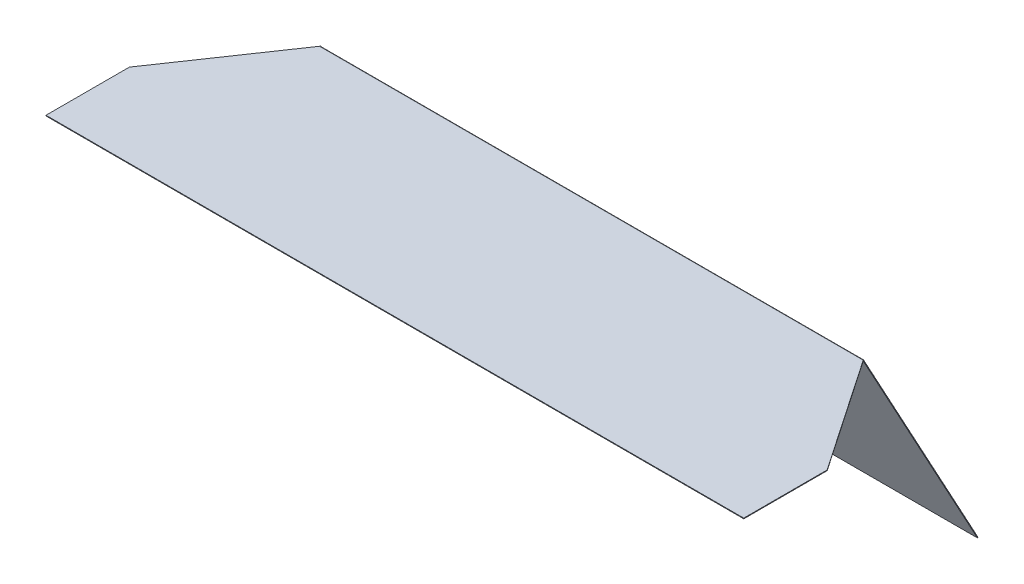
ISO-10303-21;
HEADER;
FILE_DESCRIPTION(('STEP AP214'),'2;1');
FILE_NAME('part.step','',(''),(''),'','','');
FILE_SCHEMA(('AUTOMOTIVE_DESIGN { 1 0 10303 214 1 1 1 1 }'));
ENDSEC;
DATA;
#1=APPLICATION_CONTEXT('core data for automotive mechanical design processes');
#2=APPLICATION_PROTOCOL_DEFINITION('international standard','automotive_design',2000,#1);
#3=PRODUCT_CONTEXT('',#1,'mechanical');
#4=PRODUCT('Part','Part','',(#3));
#5=PRODUCT_RELATED_PRODUCT_CATEGORY('part','',(#4));
#6=PRODUCT_DEFINITION_FORMATION('','',#4);
#7=PRODUCT_DEFINITION_CONTEXT('part definition',#1,'design');
#8=PRODUCT_DEFINITION('design','',#6,#7);
#9=PRODUCT_DEFINITION_SHAPE('','',#8);
#10=(LENGTH_UNIT() NAMED_UNIT(*) SI_UNIT(.MILLI.,.METRE.));
#11=(NAMED_UNIT(*) PLANE_ANGLE_UNIT() SI_UNIT($,.RADIAN.));
#12=(NAMED_UNIT(*) SI_UNIT($,.STERADIAN.) SOLID_ANGLE_UNIT());
#13=UNCERTAINTY_MEASURE_WITH_UNIT(LENGTH_MEASURE(1.E-05),#10,'distance_accuracy_value','');
#14=(GEOMETRIC_REPRESENTATION_CONTEXT(3) GLOBAL_UNCERTAINTY_ASSIGNED_CONTEXT((#13)) GLOBAL_UNIT_ASSIGNED_CONTEXT((#10,
#11,#12)) REPRESENTATION_CONTEXT('',''));
#15=CARTESIAN_POINT('',(0.,0.,0.));
#16=DIRECTION('',(0.,0.,1.));
#17=DIRECTION('',(1.,0.,0.));
#18=AXIS2_PLACEMENT_3D('',#15,#16,#17);
#19=CARTESIAN_POINT('',(335.,-0.800000000000009,-122.));
#20=DIRECTION('',(-1.,0.,0.));
#21=DIRECTION('',(0.,0.,1.));
#22=AXIS2_PLACEMENT_3D('',#19,#20,#21);
#23=PLANE('',#22);
#24=DIRECTION('',(0.,1.,0.));
#25=VECTOR('',#24,1.);
#26=CARTESIAN_POINT('',(335.,-0.8,-122.));
#27=LINE('',#26,#25);
#28=CARTESIAN_POINT('',(335.,-0.80108157338544,-122.));
#29=VERTEX_POINT('',#28);
#30=CARTESIAN_POINT('',(335.,0.,-122.));
#31=VERTEX_POINT('',#30);
#32=EDGE_CURVE('E305',#29,#31,#27,.T.);
#33=ORIENTED_EDGE('',*,*,#32,.F.);
#34=CARTESIAN_POINT('',(335.,-1.6,-120.613735469827));
#35=DIRECTION('',(1.,0.,0.));
#36=DIRECTION('',(0.,0.,-1.));
#37=AXIS2_PLACEMENT_3D('',#34,#35,#36);
#38=CIRCLE('',#37,1.60000000000001);
#39=CARTESIAN_POINT('',(335.,0.,-120.613735469827));
#40=VERTEX_POINT('',#39);
#41=EDGE_CURVE('E13',#29,#40,#38,.T.);
#42=ORIENTED_EDGE('',*,*,#41,.T.);
#43=DIRECTION('',(0.,0.,-1.));
#44=VECTOR('',#43,1.);
#45=CARTESIAN_POINT('',(335.,0.,-122.000000000031));
#46=LINE('',#45,#44);
#47=EDGE_CURVE('E63',#40,#31,#46,.T.);
#48=ORIENTED_EDGE('',*,*,#47,.T.);
#49=EDGE_LOOP('',(#33,#42,#48));
#50=FACE_BOUND('',#49,.T.);
#51=ADVANCED_FACE('F53',(#50),#23,.T.);
#52=CARTESIAN_POINT('',(-335.,-0.799999999999997,-120.613735469827));
#53=DIRECTION('',(1.,0.,0.));
#54=DIRECTION('',(0.,0.,-1.));
#55=AXIS2_PLACEMENT_3D('',#52,#53,#54);
#56=PLANE('',#55);
#57=DIRECTION('',(0.,0.,1.));
#58=VECTOR('',#57,1.);
#59=CARTESIAN_POINT('',(-335.,0.,-121.999999999996));
#60=LINE('',#59,#58);
#61=CARTESIAN_POINT('',(-335.,0.,-122.));
#62=VERTEX_POINT('',#61);
#63=CARTESIAN_POINT('',(-335.,0.,-120.613735469827));
#64=VERTEX_POINT('',#63);
#65=EDGE_CURVE('E301',#62,#64,#60,.T.);
#66=ORIENTED_EDGE('',*,*,#65,.T.);
#67=CARTESIAN_POINT('',(-335.,-1.6,-120.613735469827));
#68=DIRECTION('',(1.,0.,0.));
#69=DIRECTION('',(0.,0.,-1.));
#70=AXIS2_PLACEMENT_3D('',#67,#68,#69);
#71=CIRCLE('',#70,1.60000000000001);
#72=CARTESIAN_POINT('',(-335.,-0.80108157338544,-122.));
#73=VERTEX_POINT('',#72);
#74=EDGE_CURVE('E200',#64,#73,#71,.F.);
#75=ORIENTED_EDGE('',*,*,#74,.T.);
#76=DIRECTION('',(0.,1.,0.));
#77=VECTOR('',#76,1.);
#78=CARTESIAN_POINT('',(-335.,-0.8,-122.));
#79=LINE('',#78,#77);
#80=EDGE_CURVE('E302',#73,#62,#79,.T.);
#81=ORIENTED_EDGE('',*,*,#80,.T.);
#82=EDGE_LOOP('',(#66,#75,#81));
#83=FACE_BOUND('',#82,.T.);
#84=ADVANCED_FACE('F229',(#83),#56,.T.);
#85=CARTESIAN_POINT('',(-431.,-0.8,-122.));
#86=DIRECTION('',(0.,-1.,0.));
#87=DIRECTION('',(0.,0.,-1.));
#88=AXIS2_PLACEMENT_3D('',#85,#86,#87);
#89=PLANE('',#88);
#90=DIRECTION('',(1.,0.,0.));
#91=VECTOR('',#90,1.);
#92=CARTESIAN_POINT('',(335.,-0.799999999999997,-120.613735469827));
#93=LINE('',#92,#91);
#94=CARTESIAN_POINT('',(335.,-0.8,-120.613735469827));
#95=VERTEX_POINT('',#94);
#96=CARTESIAN_POINT('',(-335.,-0.8,-120.613735469827));
#97=VERTEX_POINT('',#96);
#98=EDGE_CURVE('E70',#95,#97,#93,.F.);
#99=ORIENTED_EDGE('',*,*,#98,.F.);
#100=DIRECTION('',(0.,0.,1.));
#101=VECTOR('',#100,1.);
#102=CARTESIAN_POINT('',(335.,-0.800000000000009,-122.));
#103=LINE('',#102,#101);
#104=EDGE_CURVE('E285',#29,#95,#103,.T.);
#105=ORIENTED_EDGE('',*,*,#104,.F.);
#106=DIRECTION('',(-0.562790977082026,0.,-0.826599247589217));
#107=VECTOR('',#106,1.);
#108=CARTESIAN_POINT('',(431.000000000001,-0.8,18.9999999999996));
#109=LINE('',#108,#107);
#110=CARTESIAN_POINT('',(431.000000000001,-0.8,18.9999999999996));
#111=VERTEX_POINT('',#110);
#112=EDGE_CURVE('E319',#111,#29,#109,.T.);
#113=ORIENTED_EDGE('',*,*,#112,.F.);
#114=DIRECTION('',(0.,0.,-1.));
#115=VECTOR('',#114,1.);
#116=CARTESIAN_POINT('',(431.,-0.8,122.));
#117=LINE('',#116,#115);
#118=CARTESIAN_POINT('',(431.,-0.8,122.));
#119=VERTEX_POINT('',#118);
#120=EDGE_CURVE('E290',#119,#111,#117,.T.);
#121=ORIENTED_EDGE('',*,*,#120,.F.);
#122=DIRECTION('',(1.,0.,0.));
#123=VECTOR('',#122,1.);
#124=CARTESIAN_POINT('',(-431.,-0.8,122.));
#125=LINE('',#124,#123);
#126=CARTESIAN_POINT('',(-431.,-0.8,122.));
#127=VERTEX_POINT('',#126);
#128=EDGE_CURVE('E337',#127,#119,#125,.T.);
#129=ORIENTED_EDGE('',*,*,#128,.F.);
#130=DIRECTION('',(0.,0.,1.));
#131=VECTOR('',#130,1.);
#132=CARTESIAN_POINT('',(-431.,-0.8,122.));
#133=LINE('',#132,#131);
#134=CARTESIAN_POINT('',(-431.,-0.8,19.));
#135=VERTEX_POINT('',#134);
#136=EDGE_CURVE('E298',#135,#127,#133,.T.);
#137=ORIENTED_EDGE('',*,*,#136,.F.);
#138=DIRECTION('',(-0.562790977082021,0.,0.82659924758922));
#139=VECTOR('',#138,1.);
#140=CARTESIAN_POINT('',(-335.,-0.8,-122.));
#141=LINE('',#140,#139);
#142=EDGE_CURVE('E308',#73,#135,#141,.T.);
#143=ORIENTED_EDGE('',*,*,#142,.F.);
#144=DIRECTION('',(0.,0.,-1.));
#145=VECTOR('',#144,1.);
#146=CARTESIAN_POINT('',(-335.,-0.799999999999997,-120.613735469827));
#147=LINE('',#146,#145);
#148=EDGE_CURVE('E287',#97,#73,#147,.T.);
#149=ORIENTED_EDGE('',*,*,#148,.F.);
#150=EDGE_LOOP('',(#99,#105,#113,#121,#129,#137,#143,#149));
#151=FACE_BOUND('',#150,.T.);
#152=ADVANCED_FACE('F235',(#151),#89,.T.);
#153=CARTESIAN_POINT('',(-431.,0.,-122.));
#154=DIRECTION('',(0.,-1.,0.));
#155=DIRECTION('',(0.,0.,-1.));
#156=AXIS2_PLACEMENT_3D('',#153,#154,#155);
#157=PLANE('',#156);
#158=ORIENTED_EDGE('',*,*,#47,.F.);
#159=DIRECTION('',(1.,0.,0.));
#160=VECTOR('',#159,1.);
#161=CARTESIAN_POINT('',(335.,0.,-120.613735469827));
#162=LINE('',#161,#160);
#163=EDGE_CURVE('E148',#40,#64,#162,.F.);
#164=ORIENTED_EDGE('',*,*,#163,.T.);
#165=ORIENTED_EDGE('',*,*,#65,.F.);
#166=DIRECTION('',(-0.562790977082021,0.,0.82659924758922));
#167=VECTOR('',#166,1.);
#168=CARTESIAN_POINT('',(-335.,0.,-122.));
#169=LINE('',#168,#167);
#170=CARTESIAN_POINT('',(-431.,0.,19.));
#171=VERTEX_POINT('',#170);
#172=EDGE_CURVE('E283',#62,#171,#169,.T.);
#173=ORIENTED_EDGE('',*,*,#172,.T.);
#174=DIRECTION('',(0.,0.,1.));
#175=VECTOR('',#174,1.);
#176=CARTESIAN_POINT('',(-431.,0.,122.));
#177=LINE('',#176,#175);
#178=CARTESIAN_POINT('',(-431.,0.,122.));
#179=VERTEX_POINT('',#178);
#180=EDGE_CURVE('E277',#171,#179,#177,.T.);
#181=ORIENTED_EDGE('',*,*,#180,.T.);
#182=DIRECTION('',(1.,0.,0.));
#183=VECTOR('',#182,1.);
#184=CARTESIAN_POINT('',(-431.,0.,122.));
#185=LINE('',#184,#183);
#186=CARTESIAN_POINT('',(431.,0.,122.));
#187=VERTEX_POINT('',#186);
#188=EDGE_CURVE('E268',#179,#187,#185,.T.);
#189=ORIENTED_EDGE('',*,*,#188,.T.);
#190=DIRECTION('',(0.,0.,-1.));
#191=VECTOR('',#190,1.);
#192=CARTESIAN_POINT('',(431.,0.,122.));
#193=LINE('',#192,#191);
#194=CARTESIAN_POINT('',(431.000000000001,0.,18.9999999999996));
#195=VERTEX_POINT('',#194);
#196=EDGE_CURVE('E276',#187,#195,#193,.T.);
#197=ORIENTED_EDGE('',*,*,#196,.T.);
#198=DIRECTION('',(-0.562790977082026,0.,-0.826599247589217));
#199=VECTOR('',#198,1.);
#200=CARTESIAN_POINT('',(431.000000000001,0.,18.9999999999996));
#201=LINE('',#200,#199);
#202=EDGE_CURVE('E294',#195,#31,#201,.T.);
#203=ORIENTED_EDGE('',*,*,#202,.T.);
#204=EDGE_LOOP('',(#158,#164,#165,#173,#181,#189,#197,#203));
#205=FACE_BOUND('',#204,.T.);
#206=ADVANCED_FACE('F243',(#205),#157,.F.);
#207=CARTESIAN_POINT('',(-431.,-0.8,122.));
#208=DIRECTION('',(-1.,0.,0.));
#209=DIRECTION('',(0.,0.,1.));
#210=AXIS2_PLACEMENT_3D('',#207,#208,#209);
#211=PLANE('',#210);
#212=ORIENTED_EDGE('',*,*,#180,.F.);
#213=DIRECTION('',(0.,1.,0.));
#214=VECTOR('',#213,1.);
#215=CARTESIAN_POINT('',(-431.,-0.8,19.));
#216=LINE('',#215,#214);
#217=EDGE_CURVE('E299',#135,#171,#216,.T.);
#218=ORIENTED_EDGE('',*,*,#217,.F.);
#219=ORIENTED_EDGE('',*,*,#136,.T.);
#220=DIRECTION('',(0.,1.,0.));
#221=VECTOR('',#220,1.);
#222=CARTESIAN_POINT('',(-431.,-0.8,122.));
#223=LINE('',#222,#221);
#224=EDGE_CURVE('E271',#127,#179,#223,.T.);
#225=ORIENTED_EDGE('',*,*,#224,.T.);
#226=EDGE_LOOP('',(#212,#218,#219,#225));
#227=FACE_BOUND('',#226,.T.);
#228=ADVANCED_FACE('F55',(#227),#211,.T.);
#229=CARTESIAN_POINT('',(-335.,-0.8,-122.));
#230=DIRECTION('',(-0.82659924758922,0.,-0.562790977082021));
#231=DIRECTION('',(-0.562790977082021,0.,0.82659924758922));
#232=AXIS2_PLACEMENT_3D('',#229,#230,#231);
#233=PLANE('',#232);
#234=ORIENTED_EDGE('',*,*,#172,.F.);
#235=ORIENTED_EDGE('',*,*,#80,.F.);
#236=ORIENTED_EDGE('',*,*,#142,.T.);
#237=ORIENTED_EDGE('',*,*,#217,.T.);
#238=EDGE_LOOP('',(#234,#235,#236,#237));
#239=FACE_BOUND('',#238,.T.);
#240=ADVANCED_FACE('F247',(#239),#233,.T.);
#241=CARTESIAN_POINT('',(431.000000000001,-0.8,18.9999999999996));
#242=DIRECTION('',(0.826599247589217,0.,-0.562790977082026));
#243=DIRECTION('',(-0.562790977082026,0.,-0.826599247589217));
#244=AXIS2_PLACEMENT_3D('',#241,#242,#243);
#245=PLANE('',#244);
#246=ORIENTED_EDGE('',*,*,#202,.F.);
#247=DIRECTION('',(0.,1.,0.));
#248=VECTOR('',#247,1.);
#249=CARTESIAN_POINT('',(431.000000000001,-0.8,18.9999999999996));
#250=LINE('',#249,#248);
#251=EDGE_CURVE('E303',#111,#195,#250,.T.);
#252=ORIENTED_EDGE('',*,*,#251,.F.);
#253=ORIENTED_EDGE('',*,*,#112,.T.);
#254=ORIENTED_EDGE('',*,*,#32,.T.);
#255=EDGE_LOOP('',(#246,#252,#253,#254));
#256=FACE_BOUND('',#255,.T.);
#257=ADVANCED_FACE('F250',(#256),#245,.T.);
#258=CARTESIAN_POINT('',(431.,-0.8,122.));
#259=DIRECTION('',(1.,0.,0.));
#260=DIRECTION('',(0.,0.,-1.));
#261=AXIS2_PLACEMENT_3D('',#258,#259,#260);
#262=PLANE('',#261);
#263=ORIENTED_EDGE('',*,*,#196,.F.);
#264=DIRECTION('',(0.,1.,0.));
#265=VECTOR('',#264,1.);
#266=CARTESIAN_POINT('',(431.,-0.8,122.));
#267=LINE('',#266,#265);
#268=EDGE_CURVE('E273',#119,#187,#267,.T.);
#269=ORIENTED_EDGE('',*,*,#268,.F.);
#270=ORIENTED_EDGE('',*,*,#120,.T.);
#271=ORIENTED_EDGE('',*,*,#251,.T.);
#272=EDGE_LOOP('',(#263,#269,#270,#271));
#273=FACE_BOUND('',#272,.T.);
#274=ADVANCED_FACE('F254',(#273),#262,.T.);
#275=CARTESIAN_POINT('',(-431.,-0.8,122.));
#276=DIRECTION('',(0.,0.,1.));
#277=DIRECTION('',(1.,0.,0.));
#278=AXIS2_PLACEMENT_3D('',#275,#276,#277);
#279=PLANE('',#278);
#280=ORIENTED_EDGE('',*,*,#188,.F.);
#281=ORIENTED_EDGE('',*,*,#224,.F.);
#282=ORIENTED_EDGE('',*,*,#128,.T.);
#283=ORIENTED_EDGE('',*,*,#268,.T.);
#284=EDGE_LOOP('',(#280,#281,#282,#283));
#285=FACE_BOUND('',#284,.T.);
#286=ADVANCED_FACE('F257',(#285),#279,.T.);
#287=CARTESIAN_POINT('',(-335.,-1.6,-120.613735469827));
#288=DIRECTION('',(-1.,0.,0.));
#289=DIRECTION('',(0.,0.,1.));
#290=AXIS2_PLACEMENT_3D('',#287,#288,#289);
#291=PLANE('',#290);
#292=CARTESIAN_POINT('',(-335.,-1.6,-120.613735469827));
#293=DIRECTION('',(1.,0.,0.));
#294=DIRECTION('',(0.,0.,-1.));
#295=AXIS2_PLACEMENT_3D('',#292,#293,#294);
#296=CIRCLE('',#295,0.800000000000007);
#297=CARTESIAN_POINT('',(-335.,-1.21827299179231,-121.316789159957));
#298=VERTEX_POINT('',#297);
#299=EDGE_CURVE('E149',#97,#298,#296,.F.);
#300=ORIENTED_EDGE('',*,*,#299,.F.);
#301=ORIENTED_EDGE('',*,*,#148,.T.);
#302=CARTESIAN_POINT('',(-335.,-0.836545983584618,-122.019842850086));
#303=VERTEX_POINT('',#302);
#304=EDGE_CURVE('E194',#73,#303,#71,.F.);
#305=ORIENTED_EDGE('',*,*,#304,.T.);
#306=DIRECTION('',(0.,0.477158760259613,-0.878817112661963));
#307=VECTOR('',#306,1.);
#308=CARTESIAN_POINT('',(-335.,-0.836545983584625,-122.019842850086));
#309=LINE('',#308,#307);
#310=EDGE_CURVE('E191',#298,#303,#309,.T.);
#311=ORIENTED_EDGE('',*,*,#310,.F.);
#312=EDGE_LOOP('',(#300,#301,#305,#311));
#313=FACE_BOUND('',#312,.T.);
#314=ADVANCED_FACE('F260',(#313),#291,.T.);
#315=CARTESIAN_POINT('',(335.,-1.6,-120.613735469827));
#316=DIRECTION('',(-1.,0.,0.));
#317=DIRECTION('',(0.,0.,1.));
#318=AXIS2_PLACEMENT_3D('',#315,#316,#317);
#319=PLANE('',#318);
#320=CARTESIAN_POINT('',(335.,-0.836545983584626,-122.019842850086));
#321=VERTEX_POINT('',#320);
#322=EDGE_CURVE('E139',#321,#29,#38,.T.);
#323=ORIENTED_EDGE('',*,*,#322,.T.);
#324=ORIENTED_EDGE('',*,*,#104,.T.);
#325=CARTESIAN_POINT('',(335.,-1.6,-120.613735469827));
#326=DIRECTION('',(1.,0.,0.));
#327=DIRECTION('',(0.,0.,-1.));
#328=AXIS2_PLACEMENT_3D('',#325,#326,#327);
#329=CIRCLE('',#328,0.800000000000007);
#330=CARTESIAN_POINT('',(335.,-1.21827299179231,-121.316789159957));
#331=VERTEX_POINT('',#330);
#332=EDGE_CURVE('E156',#331,#95,#329,.T.);
#333=ORIENTED_EDGE('',*,*,#332,.F.);
#334=DIRECTION('',(0.,0.477158760259613,-0.878817112661963));
#335=VECTOR('',#334,1.);
#336=CARTESIAN_POINT('',(335.,-1.21827299179232,-121.316789159957));
#337=LINE('',#336,#335);
#338=EDGE_CURVE('E153',#331,#321,#337,.T.);
#339=ORIENTED_EDGE('',*,*,#338,.T.);
#340=EDGE_LOOP('',(#323,#324,#333,#339));
#341=FACE_BOUND('',#340,.T.);
#342=ADVANCED_FACE('F154',(#341),#319,.F.);
#343=CARTESIAN_POINT('',(335.,-1.6,-120.613735469827));
#344=DIRECTION('',(1.,0.,0.));
#345=DIRECTION('',(0.,0.477158760259612,-0.878817112661963));
#346=AXIS2_PLACEMENT_3D('',#343,#344,#345);
#347=CYLINDRICAL_SURFACE('',#346,1.60000000000001);
#348=ORIENTED_EDGE('',*,*,#163,.F.);
#349=ORIENTED_EDGE('',*,*,#41,.F.);
#350=ORIENTED_EDGE('',*,*,#322,.F.);
#351=DIRECTION('',(1.,0.,0.));
#352=VECTOR('',#351,1.);
#353=CARTESIAN_POINT('',(335.,-0.836545983584627,-122.019842850086));
#354=LINE('',#353,#352);
#355=EDGE_CURVE('E145',#303,#321,#354,.T.);
#356=ORIENTED_EDGE('',*,*,#355,.F.);
#357=ORIENTED_EDGE('',*,*,#304,.F.);
#358=ORIENTED_EDGE('',*,*,#74,.F.);
#359=EDGE_LOOP('',(#348,#349,#350,#356,#357,#358));
#360=FACE_BOUND('',#359,.T.);
#361=ADVANCED_FACE('F142',(#360),#347,.T.);
#362=CARTESIAN_POINT('',(335.,-1.6,-120.613735469827));
#363=DIRECTION('',(1.,0.,0.));
#364=DIRECTION('',(0.,0.477158760259612,-0.878817112661963));
#365=AXIS2_PLACEMENT_3D('',#362,#363,#364);
#366=CYLINDRICAL_SURFACE('',#365,0.800000000000007);
#367=ORIENTED_EDGE('',*,*,#98,.T.);
#368=ORIENTED_EDGE('',*,*,#299,.T.);
#369=DIRECTION('',(-1.,0.,0.));
#370=VECTOR('',#369,1.);
#371=CARTESIAN_POINT('',(-335.,-1.21827299179231,-121.316789159957));
#372=LINE('',#371,#370);
#373=EDGE_CURVE('E161',#298,#331,#372,.F.);
#374=ORIENTED_EDGE('',*,*,#373,.T.);
#375=ORIENTED_EDGE('',*,*,#332,.T.);
#376=EDGE_LOOP('',(#367,#368,#374,#375));
#377=FACE_BOUND('',#376,.T.);
#378=ADVANCED_FACE('F208',(#377),#366,.F.);
#379=CARTESIAN_POINT('',(335.,-0.418272991792319,-121.792739145188));
#380=DIRECTION('',(1.,0.,0.));
#381=DIRECTION('',(0.,0.,-1.));
#382=AXIS2_PLACEMENT_3D('',#379,#380,#381);
#383=PLANE('',#382);
#384=DIRECTION('',(0.,0.878817112661963,0.477158760259612));
#385=VECTOR('',#384,1.);
#386=CARTESIAN_POINT('',(335.,-0.418272991792319,-121.792739145188));
#387=LINE('',#386,#385);
#388=CARTESIAN_POINT('',(335.,-261.172098489723,-263.370514901817));
#389=VERTEX_POINT('',#388);
#390=EDGE_CURVE('E168',#389,#321,#387,.T.);
#391=ORIENTED_EDGE('',*,*,#390,.T.);
#392=ORIENTED_EDGE('',*,*,#338,.F.);
#393=DIRECTION('',(0.,-0.878817112661963,-0.477158760259612));
#394=VECTOR('',#393,1.);
#395=CARTESIAN_POINT('',(335.,-0.800000000000009,-121.089685455058));
#396=LINE('',#395,#394);
#397=CARTESIAN_POINT('',(335.,-261.553825497931,-262.667461211688));
#398=VERTEX_POINT('',#397);
#399=EDGE_CURVE('E184',#398,#331,#396,.F.);
#400=ORIENTED_EDGE('',*,*,#399,.F.);
#401=DIRECTION('',(0.,-0.477158760259613,0.878817112661963));
#402=VECTOR('',#401,1.);
#403=CARTESIAN_POINT('',(335.,-261.172098489723,-263.370514901817));
#404=LINE('',#403,#402);
#405=EDGE_CURVE('E173',#389,#398,#404,.T.);
#406=ORIENTED_EDGE('',*,*,#405,.F.);
#407=EDGE_LOOP('',(#391,#392,#400,#406));
#408=FACE_BOUND('',#407,.T.);
#409=ADVANCED_FACE('F172',(#408),#383,.T.);
#410=CARTESIAN_POINT('',(-335.,-261.172098489723,-263.370514901817));
#411=DIRECTION('',(-1.,0.,0.));
#412=DIRECTION('',(0.,0.,1.));
#413=AXIS2_PLACEMENT_3D('',#410,#411,#412);
#414=PLANE('',#413);
#415=DIRECTION('',(0.,0.878817112661963,0.477158760259612));
#416=VECTOR('',#415,1.);
#417=CARTESIAN_POINT('',(-335.,-0.800000000000009,-121.089685455058));
#418=LINE('',#417,#416);
#419=CARTESIAN_POINT('',(-335.,-261.553825497931,-262.667461211688));
#420=VERTEX_POINT('',#419);
#421=EDGE_CURVE('E170',#298,#420,#418,.F.);
#422=ORIENTED_EDGE('',*,*,#421,.F.);
#423=ORIENTED_EDGE('',*,*,#310,.T.);
#424=DIRECTION('',(0.,-0.878817112661963,-0.477158760259612));
#425=VECTOR('',#424,1.);
#426=CARTESIAN_POINT('',(-335.,-261.172098489723,-263.370514901817));
#427=LINE('',#426,#425);
#428=CARTESIAN_POINT('',(-335.,-261.172098489723,-263.370514901817));
#429=VERTEX_POINT('',#428);
#430=EDGE_CURVE('E169',#303,#429,#427,.T.);
#431=ORIENTED_EDGE('',*,*,#430,.T.);
#432=DIRECTION('',(0.,-0.477158760259613,0.878817112661963));
#433=VECTOR('',#432,1.);
#434=CARTESIAN_POINT('',(-335.,-261.172098489723,-263.370514901817));
#435=LINE('',#434,#433);
#436=EDGE_CURVE('E175',#429,#420,#435,.T.);
#437=ORIENTED_EDGE('',*,*,#436,.T.);
#438=EDGE_LOOP('',(#422,#423,#431,#437));
#439=FACE_BOUND('',#438,.T.);
#440=ADVANCED_FACE('F215',(#439),#414,.T.);
#441=CARTESIAN_POINT('',(335.,-0.418272991792319,-121.792739145188));
#442=DIRECTION('',(0.,0.477158760259613,-0.878817112661963));
#443=DIRECTION('',(0.,0.878817112661963,0.477158760259612));
#444=AXIS2_PLACEMENT_3D('',#441,#442,#443);
#445=PLANE('',#444);
#446=ORIENTED_EDGE('',*,*,#430,.F.);
#447=ORIENTED_EDGE('',*,*,#355,.T.);
#448=ORIENTED_EDGE('',*,*,#390,.F.);
#449=DIRECTION('',(1.,0.,0.));
#450=VECTOR('',#449,1.);
#451=CARTESIAN_POINT('',(335.,-261.172098489723,-263.370514901817));
#452=LINE('',#451,#450);
#453=EDGE_CURVE('E176',#429,#389,#452,.T.);
#454=ORIENTED_EDGE('',*,*,#453,.F.);
#455=EDGE_LOOP('',(#446,#447,#448,#454));
#456=FACE_BOUND('',#455,.T.);
#457=ADVANCED_FACE('F166',(#456),#445,.T.);
#458=CARTESIAN_POINT('',(335.,-0.800000000000009,-121.089685455058));
#459=DIRECTION('',(0.,0.477158760259613,-0.878817112661963));
#460=DIRECTION('',(0.,0.878817112661963,0.477158760259612));
#461=AXIS2_PLACEMENT_3D('',#458,#459,#460);
#462=PLANE('',#461);
#463=ORIENTED_EDGE('',*,*,#373,.F.);
#464=ORIENTED_EDGE('',*,*,#421,.T.);
#465=DIRECTION('',(-1.,0.,0.));
#466=VECTOR('',#465,1.);
#467=CARTESIAN_POINT('',(335.,-261.553825497931,-262.667461211688));
#468=LINE('',#467,#466);
#469=EDGE_CURVE('E186',#420,#398,#468,.F.);
#470=ORIENTED_EDGE('',*,*,#469,.T.);
#471=ORIENTED_EDGE('',*,*,#399,.T.);
#472=EDGE_LOOP('',(#463,#464,#470,#471));
#473=FACE_BOUND('',#472,.T.);
#474=ADVANCED_FACE('F213',(#473),#462,.F.);
#475=CARTESIAN_POINT('',(335.,-261.172098489723,-263.370514901817));
#476=DIRECTION('',(0.,-0.878817112661963,-0.477158760259612));
#477=DIRECTION('',(0.,0.477158760259612,-0.878817112661963));
#478=AXIS2_PLACEMENT_3D('',#475,#476,#477);
#479=PLANE('',#478);
#480=ORIENTED_EDGE('',*,*,#469,.F.);
#481=ORIENTED_EDGE('',*,*,#436,.F.);
#482=ORIENTED_EDGE('',*,*,#453,.T.);
#483=ORIENTED_EDGE('',*,*,#405,.T.);
#484=EDGE_LOOP('',(#480,#481,#482,#483));
#485=FACE_BOUND('',#484,.T.);
#486=ADVANCED_FACE('F219',(#485),#479,.T.);
#487=CLOSED_SHELL('',(#51,#84,#152,#206,#228,#240,#257,#274,#286,#314,#342,#361,#378,#409,#440,
#457,#474,#486));
#488=MANIFOLD_SOLID_BREP('B2',#487);
#489=ADVANCED_BREP_SHAPE_REPRESENTATION('',(#18,#488),#14);
#490=SHAPE_DEFINITION_REPRESENTATION(#9,#489);
ENDSEC;
END-ISO-10303-21;
